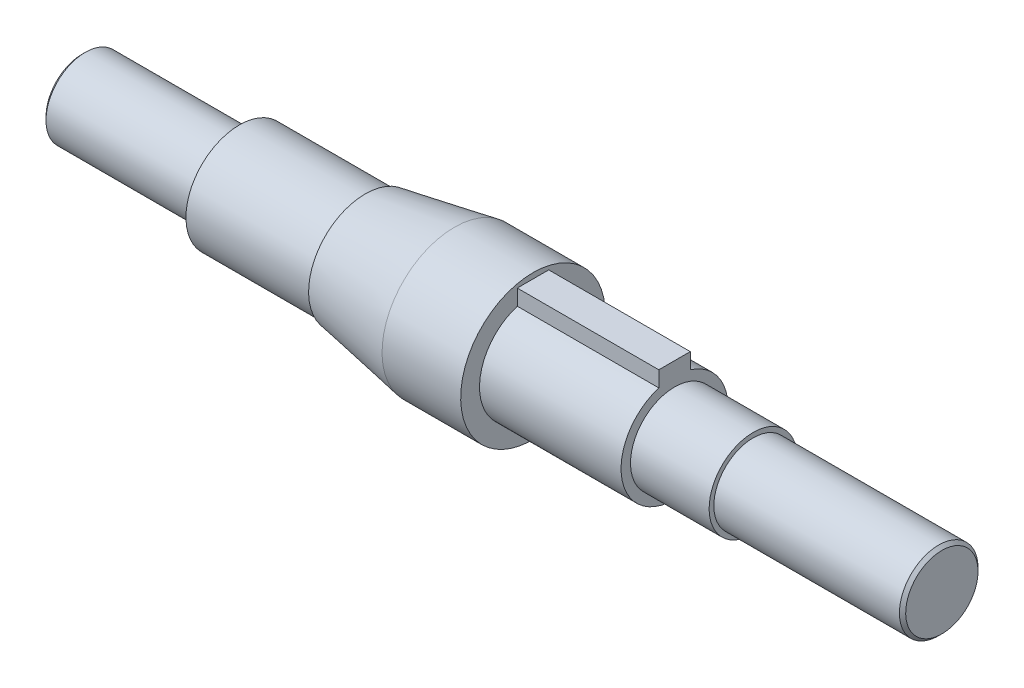
ISO-10303-21;
HEADER;
FILE_DESCRIPTION(('STEP AP214'),'2;1');
FILE_NAME('part.step','',(''),(''),'','','');
FILE_SCHEMA(('AUTOMOTIVE_DESIGN { 1 0 10303 214 1 1 1 1 }'));
ENDSEC;
DATA;
#1=APPLICATION_CONTEXT('core data for automotive mechanical design processes');
#2=APPLICATION_PROTOCOL_DEFINITION('international standard','automotive_design',2000,#1);
#3=PRODUCT_CONTEXT('',#1,'mechanical');
#4=PRODUCT('Part','Part','',(#3));
#5=PRODUCT_RELATED_PRODUCT_CATEGORY('part','',(#4));
#6=PRODUCT_DEFINITION_FORMATION('','',#4);
#7=PRODUCT_DEFINITION_CONTEXT('part definition',#1,'design');
#8=PRODUCT_DEFINITION('design','',#6,#7);
#9=PRODUCT_DEFINITION_SHAPE('','',#8);
#10=(LENGTH_UNIT() NAMED_UNIT(*) SI_UNIT(.MILLI.,.METRE.));
#11=(NAMED_UNIT(*) PLANE_ANGLE_UNIT() SI_UNIT($,.RADIAN.));
#12=(NAMED_UNIT(*) SI_UNIT($,.STERADIAN.) SOLID_ANGLE_UNIT());
#13=UNCERTAINTY_MEASURE_WITH_UNIT(LENGTH_MEASURE(1.E-05),#10,'distance_accuracy_value','');
#14=(GEOMETRIC_REPRESENTATION_CONTEXT(3) GLOBAL_UNCERTAINTY_ASSIGNED_CONTEXT((#13)) GLOBAL_UNIT_ASSIGNED_CONTEXT((#10,
#11,#12)) REPRESENTATION_CONTEXT('',''));
#15=CARTESIAN_POINT('',(0.,0.,0.));
#16=DIRECTION('',(0.,0.,1.));
#17=DIRECTION('',(1.,0.,0.));
#18=AXIS2_PLACEMENT_3D('',#15,#16,#17);
#19=CARTESIAN_POINT('',(-136.678204549044,-2.73201244085406E-13,0.));
#20=DIRECTION('',(-1.,0.,0.));
#21=DIRECTION('',(0.,-1.,0.));
#22=AXIS2_PLACEMENT_3D('',#19,#20,#21);
#23=PLANE('',#22);
#24=CARTESIAN_POINT('',(-136.678204549044,-2.73201244085406E-13,0.));
#25=DIRECTION('',(-1.,0.,0.));
#26=DIRECTION('',(0.,-1.,0.));
#27=AXIS2_PLACEMENT_3D('',#24,#25,#26);
#28=CIRCLE('',#27,11.5000000000004);
#29=CARTESIAN_POINT('',(-136.678204549044,-11.5000000000007,0.));
#30=VERTEX_POINT('',#29);
#31=EDGE_CURVE('E150',#30,#30,#28,.T.);
#32=ORIENTED_EDGE('',*,*,#31,.T.);
#33=EDGE_LOOP('',(#32));
#34=FACE_BOUND('',#33,.T.);
#35=ADVANCED_FACE('F41',(#34),#23,.T.);
#36=CARTESIAN_POINT('',(136.678204549044,0.,0.));
#37=DIRECTION('',(1.,0.,0.));
#38=DIRECTION('',(0.,1.,0.));
#39=AXIS2_PLACEMENT_3D('',#36,#37,#38);
#40=CYLINDRICAL_SURFACE('',#39,12.5000000000003);
#41=CARTESIAN_POINT('',(-135.678204549044,-2.71933526045847E-13,0.));
#42=DIRECTION('',(-1.,0.,0.));
#43=DIRECTION('',(0.,-1.,0.));
#44=AXIS2_PLACEMENT_3D('',#41,#42,#43);
#45=CIRCLE('',#44,12.5000000000003);
#46=CARTESIAN_POINT('',(-135.678204549044,-12.5000000000006,0.));
#47=VERTEX_POINT('',#46);
#48=EDGE_CURVE('E147',#47,#47,#45,.F.);
#49=ORIENTED_EDGE('',*,*,#48,.T.);
#50=EDGE_LOOP('',(#49));
#51=FACE_BOUND('',#50,.T.);
#52=CARTESIAN_POINT('',(-86.6782045490442,-2.09815342107453E-13,0.));
#53=DIRECTION('',(1.,0.,0.));
#54=DIRECTION('',(0.,1.,0.));
#55=AXIS2_PLACEMENT_3D('',#52,#53,#54);
#56=CIRCLE('',#55,12.5000000000003);
#57=CARTESIAN_POINT('',(-86.6782045490443,12.5000000000001,0.));
#58=VERTEX_POINT('',#57);
#59=EDGE_CURVE('E144',#58,#58,#56,.T.);
#60=ORIENTED_EDGE('',*,*,#59,.F.);
#61=EDGE_LOOP('',(#60));
#62=FACE_BOUND('',#61,.T.);
#63=ADVANCED_FACE('F166',(#51,#62),#40,.T.);
#64=CARTESIAN_POINT('',(-86.6782045490443,12.5000000000001,0.));
#65=DIRECTION('',(-1.,0.,0.));
#66=DIRECTION('',(0.,-1.,0.));
#67=AXIS2_PLACEMENT_3D('',#64,#65,#66);
#68=PLANE('',#67);
#69=ORIENTED_EDGE('',*,*,#59,.T.);
#70=EDGE_LOOP('',(#69));
#71=FACE_BOUND('',#70,.T.);
#72=CARTESIAN_POINT('',(-86.6782045490442,-2.09815342107453E-13,0.));
#73=DIRECTION('',(1.,0.,0.));
#74=DIRECTION('',(0.,1.,0.));
#75=AXIS2_PLACEMENT_3D('',#72,#73,#74);
#76=CIRCLE('',#75,17.0000000000002);
#77=CARTESIAN_POINT('',(-86.6782045490443,17.,0.));
#78=VERTEX_POINT('',#77);
#79=EDGE_CURVE('E141',#78,#78,#76,.T.);
#80=ORIENTED_EDGE('',*,*,#79,.F.);
#81=EDGE_LOOP('',(#80));
#82=FACE_BOUND('',#81,.T.);
#83=ADVANCED_FACE('F172',(#71,#82),#68,.T.);
#84=CARTESIAN_POINT('',(136.678204549044,0.,0.));
#85=DIRECTION('',(1.,0.,0.));
#86=DIRECTION('',(0.,1.,0.));
#87=AXIS2_PLACEMENT_3D('',#84,#85,#86);
#88=CYLINDRICAL_SURFACE('',#87,17.0000000000002);
#89=ORIENTED_EDGE('',*,*,#79,.T.);
#90=EDGE_LOOP('',(#89));
#91=FACE_BOUND('',#90,.T.);
#92=CARTESIAN_POINT('',(-46.6782045490443,-1.59106620525091E-13,0.));
#93=DIRECTION('',(1.,0.,0.));
#94=DIRECTION('',(0.,1.,0.));
#95=AXIS2_PLACEMENT_3D('',#92,#93,#94);
#96=CIRCLE('',#95,17.0000000000002);
#97=CARTESIAN_POINT('',(-46.6782045490443,17.,0.));
#98=VERTEX_POINT('',#97);
#99=EDGE_CURVE('E138',#98,#98,#96,.T.);
#100=ORIENTED_EDGE('',*,*,#99,.F.);
#101=EDGE_LOOP('',(#100));
#102=FACE_BOUND('',#101,.T.);
#103=ADVANCED_FACE('F183',(#91,#102),#88,.T.);
#104=CARTESIAN_POINT('',(-46.6782045490443,17.,0.));
#105=DIRECTION('',(-1.,0.,0.));
#106=DIRECTION('',(0.,-1.,0.));
#107=AXIS2_PLACEMENT_3D('',#104,#105,#106);
#108=PLANE('',#107);
#109=ORIENTED_EDGE('',*,*,#99,.T.);
#110=EDGE_LOOP('',(#109));
#111=FACE_BOUND('',#110,.T.);
#112=CARTESIAN_POINT('',(-46.6782045490443,-1.59106620525091E-13,0.));
#113=DIRECTION('',(1.,0.,0.));
#114=DIRECTION('',(0.,1.,0.));
#115=AXIS2_PLACEMENT_3D('',#112,#113,#114);
#116=CIRCLE('',#115,18.0000000000002);
#117=CARTESIAN_POINT('',(-46.6782045490443,18.,0.));
#118=VERTEX_POINT('',#117);
#119=EDGE_CURVE('E135',#118,#118,#116,.T.);
#120=ORIENTED_EDGE('',*,*,#119,.F.);
#121=EDGE_LOOP('',(#120));
#122=FACE_BOUND('',#121,.T.);
#123=ADVANCED_FACE('F187',(#111,#122),#108,.T.);
#124=CARTESIAN_POINT('',(-18.3217954509557,-1.23158689174327E-13,0.));
#125=DIRECTION('',(1.,0.,0.));
#126=DIRECTION('',(0.,1.,0.));
#127=AXIS2_PLACEMENT_3D('',#124,#125,#126);
#128=CONICAL_SURFACE('',#127,23.0000000000001,0.174532925199432);
#129=ORIENTED_EDGE('',*,*,#119,.T.);
#130=EDGE_LOOP('',(#129));
#131=FACE_BOUND('',#130,.T.);
#132=CARTESIAN_POINT('',(-18.3217954509557,-1.23158689174327E-13,0.));
#133=DIRECTION('',(1.,0.,0.));
#134=DIRECTION('',(0.,1.,0.));
#135=AXIS2_PLACEMENT_3D('',#132,#133,#134);
#136=CIRCLE('',#135,23.0000000000001);
#137=CARTESIAN_POINT('',(-18.3217954509557,23.,0.));
#138=VERTEX_POINT('',#137);
#139=EDGE_CURVE('E132',#138,#138,#136,.T.);
#140=ORIENTED_EDGE('',*,*,#139,.F.);
#141=EDGE_LOOP('',(#140));
#142=FACE_BOUND('',#141,.T.);
#143=ADVANCED_FACE('F191',(#131,#142),#128,.T.);
#144=CARTESIAN_POINT('',(136.678204549044,0.,0.));
#145=DIRECTION('',(1.,0.,0.));
#146=DIRECTION('',(0.,1.,0.));
#147=AXIS2_PLACEMENT_3D('',#144,#145,#146);
#148=CYLINDRICAL_SURFACE('',#147,23.0000000000001);
#149=ORIENTED_EDGE('',*,*,#139,.T.);
#150=EDGE_LOOP('',(#149));
#151=FACE_BOUND('',#150,.T.);
#152=CARTESIAN_POINT('',(6.67820454904433,0.,0.));
#153=DIRECTION('',(1.,0.,0.));
#154=DIRECTION('',(0.,1.,0.));
#155=AXIS2_PLACEMENT_3D('',#152,#153,#154);
#156=CIRCLE('',#155,23.0000000000001);
#157=CARTESIAN_POINT('',(6.6782045490443,23.,0.));
#158=VERTEX_POINT('',#157);
#159=EDGE_CURVE('E129',#158,#158,#156,.T.);
#160=ORIENTED_EDGE('',*,*,#159,.F.);
#161=EDGE_LOOP('',(#160));
#162=FACE_BOUND('',#161,.T.);
#163=ADVANCED_FACE('F195',(#151,#162),#148,.T.);
#164=CARTESIAN_POINT('',(6.67820454904432,23.,0.));
#165=DIRECTION('',(1.,0.,0.));
#166=DIRECTION('',(0.,1.,0.));
#167=AXIS2_PLACEMENT_3D('',#164,#165,#166);
#168=PLANE('',#167);
#169=DIRECTION('',(0.,-1.,0.));
#170=VECTOR('',#169,1.);
#171=CARTESIAN_POINT('',(6.67820454904433,16.2480768092719,-5.));
#172=LINE('',#171,#170);
#173=CARTESIAN_POINT('',(6.67820454904432,21.2480768092719,-5.));
#174=VERTEX_POINT('',#173);
#175=CARTESIAN_POINT('',(6.67820454904433,16.2480768092719,-5.));
#176=VERTEX_POINT('',#175);
#177=EDGE_CURVE('E110',#174,#176,#172,.T.);
#178=ORIENTED_EDGE('',*,*,#177,.T.);
#179=CARTESIAN_POINT('',(6.67820454904436,0.,0.));
#180=DIRECTION('',(1.,0.,0.));
#181=DIRECTION('',(0.,1.,0.));
#182=AXIS2_PLACEMENT_3D('',#179,#180,#181);
#183=CIRCLE('',#182,17.0000000000001);
#184=CARTESIAN_POINT('',(6.67820454904432,16.2480768092719,5.));
#185=VERTEX_POINT('',#184);
#186=EDGE_CURVE('E126',#185,#176,#183,.T.);
#187=ORIENTED_EDGE('',*,*,#186,.F.);
#188=DIRECTION('',(0.,1.,0.));
#189=VECTOR('',#188,1.);
#190=CARTESIAN_POINT('',(6.67820454904432,21.2480768092719,5.));
#191=LINE('',#190,#189);
#192=CARTESIAN_POINT('',(6.67820454904432,21.2480768092719,5.));
#193=VERTEX_POINT('',#192);
#194=EDGE_CURVE('E113',#185,#193,#191,.T.);
#195=ORIENTED_EDGE('',*,*,#194,.T.);
#196=DIRECTION('',(0.,0.,-1.));
#197=VECTOR('',#196,1.);
#198=CARTESIAN_POINT('',(6.67820454904432,21.2480768092719,-5.));
#199=LINE('',#198,#197);
#200=EDGE_CURVE('E91',#193,#174,#199,.T.);
#201=ORIENTED_EDGE('',*,*,#200,.T.);
#202=EDGE_LOOP('',(#178,#187,#195,#201));
#203=FACE_BOUND('',#202,.T.);
#204=ORIENTED_EDGE('',*,*,#159,.T.);
#205=EDGE_LOOP('',(#204));
#206=FACE_BOUND('',#205,.T.);
#207=ADVANCED_FACE('F199',(#203,#206),#168,.T.);
#208=CARTESIAN_POINT('',(136.678204549044,0.,0.));
#209=DIRECTION('',(1.,0.,0.));
#210=DIRECTION('',(0.,1.,0.));
#211=AXIS2_PLACEMENT_3D('',#208,#209,#210);
#212=CYLINDRICAL_SURFACE('',#211,17.0000000000001);
#213=DIRECTION('',(1.,0.,0.));
#214=VECTOR('',#213,1.);
#215=CARTESIAN_POINT('',(-4.50213533845462,16.2480768092719,-5.));
#216=LINE('',#215,#214);
#217=CARTESIAN_POINT('',(51.6782045490443,16.2480768092719,-5.));
#218=VERTEX_POINT('',#217);
#219=EDGE_CURVE('E66',#176,#218,#216,.T.);
#220=ORIENTED_EDGE('',*,*,#219,.T.);
#221=CARTESIAN_POINT('',(51.6782045490443,0.,0.));
#222=DIRECTION('',(1.,0.,0.));
#223=DIRECTION('',(0.,1.,0.));
#224=AXIS2_PLACEMENT_3D('',#221,#222,#223);
#225=CIRCLE('',#224,17.);
#226=CARTESIAN_POINT('',(51.6782045490443,16.2480768092719,5.));
#227=VERTEX_POINT('',#226);
#228=EDGE_CURVE('E124',#227,#218,#225,.T.);
#229=ORIENTED_EDGE('',*,*,#228,.F.);
#230=DIRECTION('',(1.,0.,0.));
#231=VECTOR('',#230,1.);
#232=CARTESIAN_POINT('',(-4.50213533845462,16.2480768092719,5.));
#233=LINE('',#232,#231);
#234=EDGE_CURVE('E94',#185,#227,#233,.T.);
#235=ORIENTED_EDGE('',*,*,#234,.F.);
#236=ORIENTED_EDGE('',*,*,#186,.T.);
#237=EDGE_LOOP('',(#220,#229,#235,#236));
#238=FACE_BOUND('',#237,.T.);
#239=ADVANCED_FACE('F203',(#238),#212,.T.);
#240=CARTESIAN_POINT('',(51.6782045490443,17.,0.));
#241=DIRECTION('',(1.,0.,0.));
#242=DIRECTION('',(0.,1.,0.));
#243=AXIS2_PLACEMENT_3D('',#240,#241,#242);
#244=PLANE('',#243);
#245=ORIENTED_EDGE('',*,*,#228,.T.);
#246=DIRECTION('',(0.,1.,0.));
#247=VECTOR('',#246,1.);
#248=CARTESIAN_POINT('',(51.6782045490443,16.2480768092719,-5.));
#249=LINE('',#248,#247);
#250=CARTESIAN_POINT('',(51.6782045490443,21.2480768092719,-5.));
#251=VERTEX_POINT('',#250);
#252=EDGE_CURVE('E95',#218,#251,#249,.T.);
#253=ORIENTED_EDGE('',*,*,#252,.T.);
#254=DIRECTION('',(0.,0.,1.));
#255=VECTOR('',#254,1.);
#256=CARTESIAN_POINT('',(51.6782045490443,21.2480768092719,-5.));
#257=LINE('',#256,#255);
#258=CARTESIAN_POINT('',(51.6782045490443,21.2480768092719,5.));
#259=VERTEX_POINT('',#258);
#260=EDGE_CURVE('E88',#251,#259,#257,.T.);
#261=ORIENTED_EDGE('',*,*,#260,.T.);
#262=DIRECTION('',(0.,-1.,0.));
#263=VECTOR('',#262,1.);
#264=CARTESIAN_POINT('',(51.6782045490443,21.2480768092719,5.));
#265=LINE('',#264,#263);
#266=EDGE_CURVE('E57',#259,#227,#265,.T.);
#267=ORIENTED_EDGE('',*,*,#266,.T.);
#268=EDGE_LOOP('',(#245,#253,#261,#267));
#269=FACE_BOUND('',#268,.T.);
#270=CARTESIAN_POINT('',(51.6782045490443,0.,0.));
#271=DIRECTION('',(1.,0.,0.));
#272=DIRECTION('',(0.,1.,0.));
#273=AXIS2_PLACEMENT_3D('',#270,#271,#272);
#274=CIRCLE('',#273,14.);
#275=CARTESIAN_POINT('',(51.6782045490443,14.,0.));
#276=VERTEX_POINT('',#275);
#277=EDGE_CURVE('E121',#276,#276,#274,.T.);
#278=ORIENTED_EDGE('',*,*,#277,.F.);
#279=EDGE_LOOP('',(#278));
#280=FACE_BOUND('',#279,.T.);
#281=ADVANCED_FACE('F101',(#269,#280),#244,.T.);
#282=CARTESIAN_POINT('',(136.678204549044,0.,0.));
#283=DIRECTION('',(1.,0.,0.));
#284=DIRECTION('',(0.,1.,0.));
#285=AXIS2_PLACEMENT_3D('',#282,#283,#284);
#286=CYLINDRICAL_SURFACE('',#285,14.);
#287=ORIENTED_EDGE('',*,*,#277,.T.);
#288=EDGE_LOOP('',(#287));
#289=FACE_BOUND('',#288,.T.);
#290=CARTESIAN_POINT('',(76.6782045490443,0.,0.));
#291=DIRECTION('',(1.,0.,0.));
#292=DIRECTION('',(0.,1.,0.));
#293=AXIS2_PLACEMENT_3D('',#290,#291,#292);
#294=CIRCLE('',#293,14.);
#295=CARTESIAN_POINT('',(76.6782045490443,14.,0.));
#296=VERTEX_POINT('',#295);
#297=EDGE_CURVE('E118',#296,#296,#294,.T.);
#298=ORIENTED_EDGE('',*,*,#297,.F.);
#299=EDGE_LOOP('',(#298));
#300=FACE_BOUND('',#299,.T.);
#301=ADVANCED_FACE('F210',(#289,#300),#286,.T.);
#302=CARTESIAN_POINT('',(76.6782045490443,14.,0.));
#303=DIRECTION('',(1.,0.,0.));
#304=DIRECTION('',(0.,1.,0.));
#305=AXIS2_PLACEMENT_3D('',#302,#303,#304);
#306=PLANE('',#305);
#307=ORIENTED_EDGE('',*,*,#297,.T.);
#308=EDGE_LOOP('',(#307));
#309=FACE_BOUND('',#308,.T.);
#310=CARTESIAN_POINT('',(76.6782045490443,0.,0.));
#311=DIRECTION('',(1.,0.,0.));
#312=DIRECTION('',(0.,1.,0.));
#313=AXIS2_PLACEMENT_3D('',#310,#311,#312);
#314=CIRCLE('',#313,12.5000000000002);
#315=CARTESIAN_POINT('',(76.6782045490443,12.5000000000002,0.));
#316=VERTEX_POINT('',#315);
#317=EDGE_CURVE('E115',#316,#316,#314,.T.);
#318=ORIENTED_EDGE('',*,*,#317,.F.);
#319=EDGE_LOOP('',(#318));
#320=FACE_BOUND('',#319,.T.);
#321=ADVANCED_FACE('F213',(#309,#320),#306,.T.);
#322=CARTESIAN_POINT('',(136.678204549044,0.,0.));
#323=DIRECTION('',(1.,0.,0.));
#324=DIRECTION('',(0.,1.,0.));
#325=AXIS2_PLACEMENT_3D('',#322,#323,#324);
#326=CYLINDRICAL_SURFACE('',#325,12.5000000000002);
#327=CARTESIAN_POINT('',(135.678204549044,0.,0.));
#328=DIRECTION('',(1.,0.,0.));
#329=DIRECTION('',(0.,1.,0.));
#330=AXIS2_PLACEMENT_3D('',#327,#328,#329);
#331=CIRCLE('',#330,12.5000000000002);
#332=CARTESIAN_POINT('',(135.678204549044,12.5000000000003,0.));
#333=VERTEX_POINT('',#332);
#334=EDGE_CURVE('E11',#333,#333,#331,.F.);
#335=ORIENTED_EDGE('',*,*,#334,.T.);
#336=EDGE_LOOP('',(#335));
#337=FACE_BOUND('',#336,.T.);
#338=ORIENTED_EDGE('',*,*,#317,.T.);
#339=EDGE_LOOP('',(#338));
#340=FACE_BOUND('',#339,.T.);
#341=ADVANCED_FACE('F217',(#337,#340),#326,.T.);
#342=CARTESIAN_POINT('',(136.678204549044,12.5000000000003,0.));
#343=DIRECTION('',(1.,0.,0.));
#344=DIRECTION('',(0.,1.,0.));
#345=AXIS2_PLACEMENT_3D('',#342,#343,#344);
#346=PLANE('',#345);
#347=CARTESIAN_POINT('',(136.678204549044,0.,0.));
#348=DIRECTION('',(1.,0.,0.));
#349=DIRECTION('',(0.,1.,0.));
#350=AXIS2_PLACEMENT_3D('',#347,#348,#349);
#351=CIRCLE('',#350,11.5000000000003);
#352=CARTESIAN_POINT('',(136.678204549044,11.5000000000004,0.));
#353=VERTEX_POINT('',#352);
#354=EDGE_CURVE('E50',#353,#353,#351,.T.);
#355=ORIENTED_EDGE('',*,*,#354,.T.);
#356=EDGE_LOOP('',(#355));
#357=FACE_BOUND('',#356,.T.);
#358=ADVANCED_FACE('F155',(#357),#346,.T.);
#359=CARTESIAN_POINT('',(-4.50213533845463,21.2480768092719,-5.));
#360=DIRECTION('',(0.,1.,0.));
#361=DIRECTION('',(-1.,0.,0.));
#362=AXIS2_PLACEMENT_3D('',#359,#360,#361);
#363=PLANE('',#362);
#364=ORIENTED_EDGE('',*,*,#200,.F.);
#365=DIRECTION('',(1.,0.,0.));
#366=VECTOR('',#365,1.);
#367=CARTESIAN_POINT('',(-4.50213533845463,21.2480768092719,5.));
#368=LINE('',#367,#366);
#369=EDGE_CURVE('E85',#193,#259,#368,.T.);
#370=ORIENTED_EDGE('',*,*,#369,.T.);
#371=ORIENTED_EDGE('',*,*,#260,.F.);
#372=DIRECTION('',(1.,0.,0.));
#373=VECTOR('',#372,1.);
#374=CARTESIAN_POINT('',(-4.50213533845463,21.2480768092719,-5.));
#375=LINE('',#374,#373);
#376=EDGE_CURVE('E108',#174,#251,#375,.T.);
#377=ORIENTED_EDGE('',*,*,#376,.F.);
#378=EDGE_LOOP('',(#364,#370,#371,#377));
#379=FACE_BOUND('',#378,.T.);
#380=ADVANCED_FACE('F86',(#379),#363,.T.);
#381=CARTESIAN_POINT('',(-4.50213533845462,16.2480768092719,-5.));
#382=DIRECTION('',(0.,0.,-1.));
#383=DIRECTION('',(0.,1.,0.));
#384=AXIS2_PLACEMENT_3D('',#381,#382,#383);
#385=PLANE('',#384);
#386=ORIENTED_EDGE('',*,*,#177,.F.);
#387=ORIENTED_EDGE('',*,*,#376,.T.);
#388=ORIENTED_EDGE('',*,*,#252,.F.);
#389=ORIENTED_EDGE('',*,*,#219,.F.);
#390=EDGE_LOOP('',(#386,#387,#388,#389));
#391=FACE_BOUND('',#390,.T.);
#392=ADVANCED_FACE('F226',(#391),#385,.T.);
#393=CARTESIAN_POINT('',(-4.50213533845463,21.2480768092719,5.));
#394=DIRECTION('',(0.,0.,1.));
#395=DIRECTION('',(0.,-1.,0.));
#396=AXIS2_PLACEMENT_3D('',#393,#394,#395);
#397=PLANE('',#396);
#398=ORIENTED_EDGE('',*,*,#194,.F.);
#399=ORIENTED_EDGE('',*,*,#234,.T.);
#400=ORIENTED_EDGE('',*,*,#266,.F.);
#401=ORIENTED_EDGE('',*,*,#369,.F.);
#402=EDGE_LOOP('',(#398,#399,#400,#401));
#403=FACE_BOUND('',#402,.T.);
#404=ADVANCED_FACE('F97',(#403),#397,.T.);
#405=CARTESIAN_POINT('',(-135.678204549044,-2.71933526045847E-13,0.));
#406=DIRECTION('',(1.,0.,0.));
#407=DIRECTION('',(0.,1.,0.));
#408=AXIS2_PLACEMENT_3D('',#405,#406,#407);
#409=CONICAL_SURFACE('',#408,12.5000000000003,0.785398163397474);
#410=ORIENTED_EDGE('',*,*,#31,.F.);
#411=EDGE_LOOP('',(#410));
#412=FACE_BOUND('',#411,.T.);
#413=ORIENTED_EDGE('',*,*,#48,.F.);
#414=EDGE_LOOP('',(#413));
#415=FACE_BOUND('',#414,.T.);
#416=ADVANCED_FACE('F158',(#412,#415),#409,.T.);
#417=CARTESIAN_POINT('',(136.678204549044,0.,0.));
#418=DIRECTION('',(-1.,0.,0.));
#419=DIRECTION('',(0.,-1.,0.));
#420=AXIS2_PLACEMENT_3D('',#417,#418,#419);
#421=CONICAL_SURFACE('',#420,11.5000000000003,0.785398163397448);
#422=ORIENTED_EDGE('',*,*,#334,.F.);
#423=EDGE_LOOP('',(#422));
#424=FACE_BOUND('',#423,.T.);
#425=ORIENTED_EDGE('',*,*,#354,.F.);
#426=EDGE_LOOP('',(#425));
#427=FACE_BOUND('',#426,.T.);
#428=ADVANCED_FACE('F44',(#424,#427),#421,.T.);
#429=CLOSED_SHELL('',(#35,#63,#83,#103,#123,#143,#163,#207,#239,#281,#301,#321,#341,#358,#380,
#392,#404,#416,#428));
#430=MANIFOLD_SOLID_BREP('B2',#429);
#431=ADVANCED_BREP_SHAPE_REPRESENTATION('',(#18,#430),#14);
#432=SHAPE_DEFINITION_REPRESENTATION(#9,#431);
ENDSEC;
END-ISO-10303-21;
